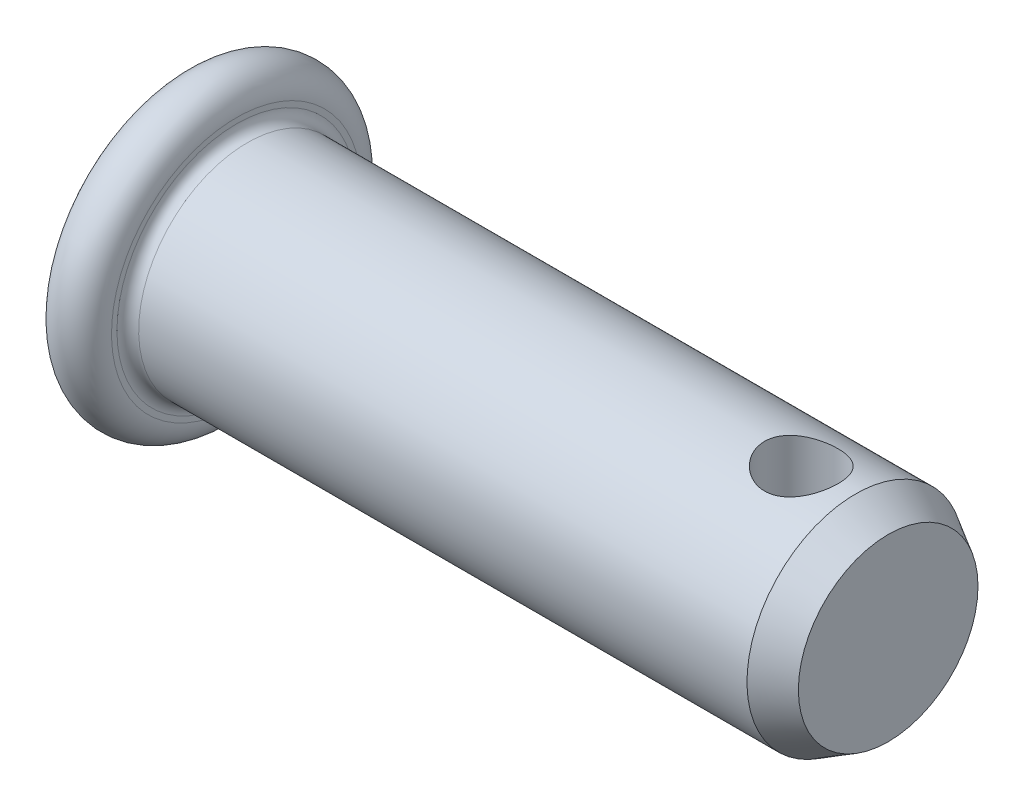
ISO-10303-21;
HEADER;
FILE_DESCRIPTION(('STEP AP214'),'2;1');
FILE_NAME('part.step','',(''),(''),'','','');
FILE_SCHEMA(('AUTOMOTIVE_DESIGN { 1 0 10303 214 1 1 1 1 }'));
ENDSEC;
DATA;
#1=APPLICATION_CONTEXT('core data for automotive mechanical design processes');
#2=APPLICATION_PROTOCOL_DEFINITION('international standard','automotive_design',2000,#1);
#3=PRODUCT_CONTEXT('',#1,'mechanical');
#4=PRODUCT('Part','Part','',(#3));
#5=PRODUCT_RELATED_PRODUCT_CATEGORY('part','',(#4));
#6=PRODUCT_DEFINITION_FORMATION('','',#4);
#7=PRODUCT_DEFINITION_CONTEXT('part definition',#1,'design');
#8=PRODUCT_DEFINITION('design','',#6,#7);
#9=PRODUCT_DEFINITION_SHAPE('','',#8);
#10=(LENGTH_UNIT() NAMED_UNIT(*) SI_UNIT(.MILLI.,.METRE.));
#11=(NAMED_UNIT(*) PLANE_ANGLE_UNIT() SI_UNIT($,.RADIAN.));
#12=(NAMED_UNIT(*) SI_UNIT($,.STERADIAN.) SOLID_ANGLE_UNIT());
#13=UNCERTAINTY_MEASURE_WITH_UNIT(LENGTH_MEASURE(1.E-05),#10,'distance_accuracy_value','');
#14=(GEOMETRIC_REPRESENTATION_CONTEXT(3) GLOBAL_UNCERTAINTY_ASSIGNED_CONTEXT((#13)) GLOBAL_UNIT_ASSIGNED_CONTEXT((#10,
#11,#12)) REPRESENTATION_CONTEXT('',''));
#15=CARTESIAN_POINT('',(0.,0.,0.));
#16=DIRECTION('',(0.,0.,1.));
#17=DIRECTION('',(1.,0.,0.));
#18=AXIS2_PLACEMENT_3D('',#15,#16,#17);
#19=CARTESIAN_POINT('',(32.5,0.,0.));
#20=DIRECTION('',(-1.,0.,0.));
#21=DIRECTION('',(0.,-1.,0.));
#22=AXIS2_PLACEMENT_3D('',#19,#20,#21);
#23=PLANE('',#22);
#24=CARTESIAN_POINT('',(32.5,0.,0.));
#25=DIRECTION('',(-1.,0.,0.));
#26=DIRECTION('',(0.,-1.,0.));
#27=AXIS2_PLACEMENT_3D('',#24,#25,#26);
#28=CIRCLE('',#27,4.13397459621556);
#29=CARTESIAN_POINT('',(32.5,-4.13397459621556,0.));
#30=VERTEX_POINT('',#29);
#31=EDGE_CURVE('E121',#30,#30,#28,.T.);
#32=ORIENTED_EDGE('',*,*,#31,.F.);
#33=EDGE_LOOP('',(#32));
#34=FACE_BOUND('',#33,.T.);
#35=ADVANCED_FACE('F41',(#34),#23,.F.);
#36=CARTESIAN_POINT('',(0.,0.,0.));
#37=DIRECTION('',(1.,0.,0.));
#38=DIRECTION('',(0.,1.,0.));
#39=AXIS2_PLACEMENT_3D('',#36,#37,#38);
#40=PLANE('',#39);
#41=CARTESIAN_POINT('',(0.,0.,0.));
#42=DIRECTION('',(-1.,0.,0.));
#43=DIRECTION('',(0.,-1.,0.));
#44=AXIS2_PLACEMENT_3D('',#41,#42,#43);
#45=CIRCLE('',#44,5.75);
#46=CARTESIAN_POINT('',(0.,-5.75,0.));
#47=VERTEX_POINT('',#46);
#48=EDGE_CURVE('E61',#47,#47,#45,.T.);
#49=ORIENTED_EDGE('',*,*,#48,.T.);
#50=EDGE_LOOP('',(#49));
#51=FACE_BOUND('',#50,.T.);
#52=ADVANCED_FACE('F92',(#51),#40,.F.);
#53=CARTESIAN_POINT('',(1.25,0.,0.));
#54=DIRECTION('',(-1.,0.,0.));
#55=DIRECTION('',(0.,-1.,0.));
#56=AXIS2_PLACEMENT_3D('',#53,#54,#55);
#57=TOROIDAL_SURFACE('',#56,5.75,1.25);
#58=ORIENTED_EDGE('',*,*,#48,.F.);
#59=EDGE_LOOP('',(#58));
#60=FACE_BOUND('',#59,.T.);
#61=CARTESIAN_POINT('',(2.5,0.,0.));
#62=DIRECTION('',(-1.,0.,0.));
#63=DIRECTION('',(0.,-1.,0.));
#64=AXIS2_PLACEMENT_3D('',#61,#62,#63);
#65=CIRCLE('',#64,5.75);
#66=CARTESIAN_POINT('',(2.5,-5.75,0.));
#67=VERTEX_POINT('',#66);
#68=EDGE_CURVE('E112',#67,#67,#65,.T.);
#69=ORIENTED_EDGE('',*,*,#68,.T.);
#70=EDGE_LOOP('',(#69));
#71=FACE_BOUND('',#70,.T.);
#72=ADVANCED_FACE('F97',(#60,#71),#57,.T.);
#73=CARTESIAN_POINT('',(2.5,5.,0.));
#74=DIRECTION('',(-1.,0.,0.));
#75=DIRECTION('',(0.,-1.,0.));
#76=AXIS2_PLACEMENT_3D('',#73,#74,#75);
#77=PLANE('',#76);
#78=CARTESIAN_POINT('',(2.5,0.,0.));
#79=DIRECTION('',(-1.,0.,0.));
#80=DIRECTION('',(0.,-1.,0.));
#81=AXIS2_PLACEMENT_3D('',#78,#79,#80);
#82=CIRCLE('',#81,5.5);
#83=CARTESIAN_POINT('',(2.5,-5.5,0.));
#84=VERTEX_POINT('',#83);
#85=EDGE_CURVE('E55',#84,#84,#82,.T.);
#86=ORIENTED_EDGE('',*,*,#85,.T.);
#87=EDGE_LOOP('',(#86));
#88=FACE_BOUND('',#87,.T.);
#89=ORIENTED_EDGE('',*,*,#68,.F.);
#90=EDGE_LOOP('',(#89));
#91=FACE_BOUND('',#90,.T.);
#92=ADVANCED_FACE('F87',(#88,#91),#77,.F.);
#93=CARTESIAN_POINT('',(-19.830028721469,0.,0.));
#94=DIRECTION('',(-1.,0.,0.));
#95=DIRECTION('',(0.,-1.,0.));
#96=AXIS2_PLACEMENT_3D('',#93,#94,#95);
#97=CYLINDRICAL_SURFACE('',#96,5.);
#98=CARTESIAN_POINT('',(30.19,-5.,0.));
#99=CARTESIAN_POINT('',(30.1900006918504,-5.00000045056717,-0.0921385131153169));
#100=CARTESIAN_POINT('',(30.1824405119812,-4.99742980033067,-0.184272351405152));
#101=CARTESIAN_POINT('',(30.152495224045,-4.98742855442286,-0.365821855868845));
#102=CARTESIAN_POINT('',(30.1301089883997,-4.97999758910651,-0.455237314758522));
#103=CARTESIAN_POINT('',(30.0713696916064,-4.96108211682783,-0.628706537182501));
#104=CARTESIAN_POINT('',(30.0350403717091,-4.94960450288728,-0.712769133037777));
#105=CARTESIAN_POINT('',(29.949554915602,-4.92376417409423,-0.873607547611714));
#106=CARTESIAN_POINT('',(29.9003961389006,-4.90940086546343,-0.950381861853274));
#107=CARTESIAN_POINT('',(29.7888159478463,-4.87872761336153,-1.09718908516297));
#108=CARTESIAN_POINT('',(29.726020551823,-4.86237009414981,-1.16692774930251));
#109=CARTESIAN_POINT('',(29.5897445946719,-4.82981068297855,-1.29511038759622));
#110=CARTESIAN_POINT('',(29.5162615975571,-4.81360882739877,-1.35355177971134));
#111=CARTESIAN_POINT('',(29.3580234426598,-4.78266857450005,-1.45918054224399));
#112=CARTESIAN_POINT('',(29.2729982244481,-4.76798796706557,-1.5059819132161));
#113=CARTESIAN_POINT('',(29.0957073752976,-4.7424775851353,-1.58449458498341));
#114=CARTESIAN_POINT('',(29.003444035897,-4.73164659783481,-1.61621063940347));
#115=CARTESIAN_POINT('',(28.8176471158009,-4.71556355120261,-1.66254228036207));
#116=CARTESIAN_POINT('',(28.7242673446411,-4.71013180305776,-1.67771041442634));
#117=CARTESIAN_POINT('',(28.5361423592289,-4.70493129849957,-1.69224311493125));
#118=CARTESIAN_POINT('',(28.4413975907791,-4.70516073326958,-1.69161272918972));
#119=CARTESIAN_POINT('',(28.257979152769,-4.71109947063846,-1.67499459106792));
#120=CARTESIAN_POINT('',(28.1692298883246,-4.71654983323877,-1.65973249174622));
#121=CARTESIAN_POINT('',(27.9956347725773,-4.73189189293263,-1.61546963423993));
#122=CARTESIAN_POINT('',(27.9107894024014,-4.74178413584829,-1.58646718760539));
#123=CARTESIAN_POINT('',(27.7457802305489,-4.76507670387297,-1.5150803423626));
#124=CARTESIAN_POINT('',(27.665716277077,-4.77853200768648,-1.47248386332134));
#125=CARTESIAN_POINT('',(27.5136452842373,-4.80741209390034,-1.37526536695573));
#126=CARTESIAN_POINT('',(27.4416406337687,-4.82283745737049,-1.32063979819046));
#127=CARTESIAN_POINT('',(27.3036607504199,-4.85493361131289,-1.1974462526055));
#128=CARTESIAN_POINT('',(27.2382180100354,-4.87162676708435,-1.12828646225945));
#129=CARTESIAN_POINT('',(27.1197183671268,-4.90365328955362,-0.979769469863469));
#130=CARTESIAN_POINT('',(27.0666627204889,-4.9189865182753,-0.900411235090659));
#131=CARTESIAN_POINT('',(26.973998382321,-4.94677682639062,-0.732596479150803));
#132=CARTESIAN_POINT('',(26.9345360277025,-4.95920217067292,-0.644053535548994));
#133=CARTESIAN_POINT('',(26.8712327603327,-4.9795458915031,-0.461064996672977));
#134=CARTESIAN_POINT('',(26.8473862613948,-4.98746587959759,-0.366621525424761));
#135=CARTESIAN_POINT('',(26.8169434906425,-4.99763779991018,-0.179017979212137));
#136=CARTESIAN_POINT('',(26.8096279601887,-5.00012589830827,-0.0859872719132688));
#137=CARTESIAN_POINT('',(26.8104010586122,-4.99986429340045,0.0999932499399075));
#138=CARTESIAN_POINT('',(26.8184870040828,-4.9971155025203,0.192943075763361));
#139=CARTESIAN_POINT('',(26.8492665278181,-4.9868449335468,0.373220245910748));
#140=CARTESIAN_POINT('',(26.8715154762021,-4.9794685322321,0.46063260688111));
#141=CARTESIAN_POINT('',(26.9294304072199,-4.96083062033554,0.630446107073972));
#142=CARTESIAN_POINT('',(26.9650981094489,-4.94956861183369,0.712846602459817));
#143=CARTESIAN_POINT('',(27.0498918993164,-4.92392538615764,0.872751427938536));
#144=CARTESIAN_POINT('',(27.09935194724,-4.9094689041066,0.950066248868446));
#145=CARTESIAN_POINT('',(27.2099358504471,-4.87907195541903,1.09553093716916));
#146=CARTESIAN_POINT('',(27.2710633560279,-4.86313102515738,1.16367792487296));
#147=CARTESIAN_POINT('',(27.4066278547169,-4.83061488465068,1.29219257149813));
#148=CARTESIAN_POINT('',(27.4815537449685,-4.81404489292989,1.35204709165641));
#149=CARTESIAN_POINT('',(27.6407395608002,-4.78290162302843,1.45840083890517));
#150=CARTESIAN_POINT('',(27.7249996274417,-4.76832837503072,1.5048998641244));
#151=CARTESIAN_POINT('',(27.9005558467309,-4.74296479117321,1.58302861289797));
#152=CARTESIAN_POINT('',(27.9918411713276,-4.73216877047788,1.6146807061863));
#153=CARTESIAN_POINT('',(28.1788975745702,-4.71575556278436,1.66201363128498));
#154=CARTESIAN_POINT('',(28.2746665345621,-4.71013595521709,1.67770192836753));
#155=CARTESIAN_POINT('',(28.4625321038996,-4.70499226252193,1.69206974596965));
#156=CARTESIAN_POINT('',(28.5545557184338,-4.70516208036229,1.69160337024957));
#157=CARTESIAN_POINT('',(28.7371397493141,-4.71081828526887,1.67578638358827));
#158=CARTESIAN_POINT('',(28.8277002571394,-4.71630433862495,1.66043670689989));
#159=CARTESIAN_POINT('',(29.0029727124063,-4.73174387519661,1.61590051246225));
#160=CARTESIAN_POINT('',(29.0877656012953,-4.74160540451003,1.58699813825242));
#161=CARTESIAN_POINT('',(29.2513623914585,-4.76464852544708,1.51640905723716));
#162=CARTESIAN_POINT('',(29.3301649351356,-4.77783086676635,1.47471946316784));
#163=CARTESIAN_POINT('',(29.4833584654807,-4.80676383911182,1.37756883958769));
#164=CARTESIAN_POINT('',(29.5573954528445,-4.8226028540317,1.32157609835243));
#165=CARTESIAN_POINT('',(29.6952981751836,-4.85470196582897,1.19829918039497));
#166=CARTESIAN_POINT('',(29.7591609864161,-4.87096218219153,1.13101176930181));
#167=CARTESIAN_POINT('',(29.8775130005392,-4.90286225421893,0.983784682070706));
#168=CARTESIAN_POINT('',(29.93151781827,-4.91845031404995,0.903442955866436));
#169=CARTESIAN_POINT('',(30.0252007714089,-4.94652737592363,0.734304028241292));
#170=CARTESIAN_POINT('',(30.0648820931723,-4.95901706702509,0.645508712937846));
#171=CARTESIAN_POINT('',(30.1274112572639,-4.97910830402289,0.465200551816097));
#172=CARTESIAN_POINT('',(30.1508050538972,-4.9868671747766,0.373895037638043));
#173=CARTESIAN_POINT('',(30.1820967790642,-4.9973120419477,0.188390810790899));
#174=CARTESIAN_POINT('',(30.1899992927232,-4.99999953938636,0.0941929625841441));
#175=CARTESIAN_POINT('',(30.19,-5.,0.));
#176=B_SPLINE_CURVE_WITH_KNOTS('',3,(#98,#99,#100,#101,#102,#103,#104,#105,#106,#107,#108,#109,
#110,#111,#112,#113,#114,#115,#116,#117,#118,#119,#120,#121,#122,#123,#124,#125,#126,#127,#128,
#129,#130,#131,#132,#133,#134,#135,#136,#137,#138,#139,#140,#141,#142,#143,#144,#145,#146,#147,
#148,#149,#150,#151,#152,#153,#154,#155,#156,#157,#158,#159,#160,#161,#162,#163,#164,#165,#166,
#167,#168,#169,#170,#171,#172,#173,#174,#175),.UNSPECIFIED.,.T.,.F.,(4,2,2,2,2,2,2,2,2,2,2,2,2,
2,2,2,2,2,2,2,2,2,2,2,2,2,2,2,2,2,2,2,2,2,2,2,2,2,4),(0.,0.276068824773617,0.552158648049831,
0.827780436845123,1.10345899746949,1.38795697907979,1.67251990722093,1.9655383046997,
2.25846430611443,2.54127784994968,2.82400103259505,3.09339103343423,3.36281414621345,
3.63666483506981,3.91059648363437,4.1992596234399,4.48795201714565,4.77966169105388,
5.07126695594427,5.34991803682659,5.62852057263642,5.89878121161704,6.16907649593834,
6.44658980000861,6.72419007002309,7.01477826618177,7.30537085441404,7.59552419187038,
7.88554178025712,8.16025065602602,8.43494228891764,8.70411601025341,8.97335055391011,
9.25460455637491,9.53593923729816,9.8286680317086,10.1213316664941,10.4036396792684,
10.6858641216143),.UNSPECIFIED.);
#177=CARTESIAN_POINT('',(30.19,-5.,0.));
#178=VERTEX_POINT('',#177);
#179=EDGE_CURVE('E45',#178,#178,#176,.T.);
#180=ORIENTED_EDGE('',*,*,#179,.T.);
#181=EDGE_LOOP('',(#180));
#182=FACE_BOUND('',#181,.T.);
#183=CARTESIAN_POINT('',(28.5,4.70573054902212,1.69));
#184=CARTESIAN_POINT('',(28.408031457333,4.70573000528724,1.69000070852625));
#185=CARTESIAN_POINT('',(28.3160676352778,4.70845614295335,1.68246736586167));
#186=CARTESIAN_POINT('',(28.134869748614,4.71900744775723,1.65263836623879));
#187=CARTESIAN_POINT('',(28.0456360721963,4.72683333651731,1.63034062008839));
#188=CARTESIAN_POINT('',(27.8725537881386,4.74659862882114,1.57185969208586));
#189=CARTESIAN_POINT('',(27.7886947752268,4.75852978056925,1.53570434825443));
#190=CARTESIAN_POINT('',(27.628204796293,4.78514912030707,1.45063003281527));
#191=CARTESIAN_POINT('',(27.5515754998777,4.79983794281378,1.40170812271493));
#192=CARTESIAN_POINT('',(27.4046364158929,4.83098043192526,1.29038050191949));
#193=CARTESIAN_POINT('',(27.3346598616982,4.84747897413991,1.22754740792189));
#194=CARTESIAN_POINT('',(27.2060091852618,4.88000316329026,1.09109255205413));
#195=CARTESIAN_POINT('',(27.1473369362658,4.89602873147709,1.01746900564205));
#196=CARTESIAN_POINT('',(27.0414385412422,4.9263223701437,0.85907645177216));
#197=CARTESIAN_POINT('',(26.9945629404002,4.9405315337328,0.774060813082532));
#198=CARTESIAN_POINT('',(26.9159106702385,4.96506149834048,0.596788082066136));
#199=CARTESIAN_POINT('',(26.8841298094177,4.97538337861325,0.504533008283437));
#200=CARTESIAN_POINT('',(26.8377032882565,4.99065784685647,0.318895105621448));
#201=CARTESIAN_POINT('',(26.8224864718865,4.99578894278889,0.225670081395816));
#202=CARTESIAN_POINT('',(26.8078024286421,5.00073809893505,0.0378581123198386));
#203=CARTESIAN_POINT('',(26.8083310304546,5.00055756631804,-0.056728465187736));
#204=CARTESIAN_POINT('',(26.8247636935164,4.99502398684516,-0.240530442796588));
#205=CARTESIAN_POINT('',(26.8400470762719,4.98987974909304,-0.329808656609213));
#206=CARTESIAN_POINT('',(26.8845271718276,4.97526018255719,-0.504449183690134));
#207=CARTESIAN_POINT('',(26.9137248341748,4.9657845581901,-0.589811229272951));
#208=CARTESIAN_POINT('',(26.9855588574035,4.94330427659483,-0.755536260667337));
#209=CARTESIAN_POINT('',(27.0283691724393,4.93025425993232,-0.835817438593924));
#210=CARTESIAN_POINT('',(27.1260688967338,4.90197960145489,-0.988237741697666));
#211=CARTESIAN_POINT('',(27.180961730445,4.88675434355877,-1.0603745497937));
#212=CARTESIAN_POINT('',(27.3043817854772,4.85486204601166,-1.19814745922028));
#213=CARTESIAN_POINT('',(27.3734396876571,4.8381608878543,-1.26330096757399));
#214=CARTESIAN_POINT('',(27.5216397307293,4.80581602303003,-1.38126125433041));
#215=CARTESIAN_POINT('',(27.6007835150626,4.79017248933464,-1.43406601658603));
#216=CARTESIAN_POINT('',(27.7684772701205,4.76152418153718,-1.52652370830052));
#217=CARTESIAN_POINT('',(27.85715068464,4.74856257864028,-1.56596714724568));
#218=CARTESIAN_POINT('',(28.0404298010655,4.72724497541913,-1.6291965766666));
#219=CARTESIAN_POINT('',(28.1350329129242,4.7188869796739,-1.65298935175003));
#220=CARTESIAN_POINT('',(28.3228003247017,4.70817645900976,-1.68324735084615));
#221=CARTESIAN_POINT('',(28.4158289024272,4.70556412713611,-1.6904628838659));
#222=CARTESIAN_POINT('',(28.601784692007,4.70591345274982,-1.68949122272273));
#223=CARTESIAN_POINT('',(28.6947119196484,4.70887406087362,-1.68130692828925));
#224=CARTESIAN_POINT('',(28.8743696322845,4.71977612743211,-1.65044286868273));
#225=CARTESIAN_POINT('',(28.9612029211109,4.72753617455771,-1.62829050474267));
#226=CARTESIAN_POINT('',(29.1299003739918,4.74696151170112,-1.57075522808946));
#227=CARTESIAN_POINT('',(29.2117636384885,4.75862750620782,-1.53536992850785));
#228=CARTESIAN_POINT('',(29.3711367765386,4.78501786010993,-1.45107186939905));
#229=CARTESIAN_POINT('',(29.4484197645754,4.79982903992135,-1.40175808389253));
#230=CARTESIAN_POINT('',(29.5938846017369,4.83067495097899,-1.29145428764301));
#231=CARTESIAN_POINT('',(29.6620636849067,4.84671005176271,-1.23046074198519));
#232=CARTESIAN_POINT('',(29.79088843422,4.87916082844229,-1.09493086460888));
#233=CARTESIAN_POINT('',(29.8509913950697,4.89555582044436,-1.01987217556628));
#234=CARTESIAN_POINT('',(29.957787176883,4.92609562252592,-0.860330721449053));
#235=CARTESIAN_POINT('',(30.0044804332735,4.94024050566211,-0.775848262497655));
#236=CARTESIAN_POINT('',(30.0827123723036,4.96462493653938,-0.600248030552293));
#237=CARTESIAN_POINT('',(30.1143462045983,4.97488891771341,-0.509176222637726));
#238=CARTESIAN_POINT('',(30.1617134829704,4.99045939950963,-0.322588725796816));
#239=CARTESIAN_POINT('',(30.1774528488992,4.99576774578906,-0.227074705235694));
#240=CARTESIAN_POINT('',(30.1920398648111,5.00068566157363,-0.0392712628295689));
#241=CARTESIAN_POINT('',(30.1916656206947,5.00055774538541,0.0529514913033055));
#242=CARTESIAN_POINT('',(30.1759642211632,4.995267920959,0.235958959364557));
#243=CARTESIAN_POINT('',(30.1606383369512,4.99010644067936,0.326743794879339));
#244=CARTESIAN_POINT('',(30.1159889659031,4.97542847606851,0.502783611495429));
#245=CARTESIAN_POINT('',(30.0869037664643,4.96598623879562,0.588105665739278));
#246=CARTESIAN_POINT('',(30.0157835477129,4.94371953745451,0.752689408815463));
#247=CARTESIAN_POINT('',(29.9737461647608,4.93089445611382,0.831949988193377));
#248=CARTESIAN_POINT('',(29.8760978355215,4.90257940411559,0.985410864263535));
#249=CARTESIAN_POINT('',(29.8200360444139,4.88700737996888,1.05930893455233));
#250=CARTESIAN_POINT('',(29.6966909016656,4.85514405204458,1.19690149043362));
#251=CARTESIAN_POINT('',(29.6294039189462,4.83885251678038,1.26059266122734));
#252=CARTESIAN_POINT('',(29.4822562117124,4.80659724574638,1.37859382499613));
#253=CARTESIAN_POINT('',(29.4019961189298,4.79067362365059,1.43241839089534));
#254=CARTESIAN_POINT('',(29.233071520515,4.76176303840917,1.52578272074006));
#255=CARTESIAN_POINT('',(29.1444089204399,4.74877541167691,1.56532571378233));
#256=CARTESIAN_POINT('',(28.9643991527001,4.72777691403826,1.62762854332163));
#257=CARTESIAN_POINT('',(28.8732621061069,4.71960435057483,1.65093912359502));
#258=CARTESIAN_POINT('',(28.68808099871,4.70858243533796,1.6821216204916));
#259=CARTESIAN_POINT('',(28.5940380316302,4.7057311049922,1.68999927553039));
#260=CARTESIAN_POINT('',(28.5,4.70573054902212,1.69));
#261=B_SPLINE_CURVE_WITH_KNOTS('',3,(#183,#184,#185,#186,#187,#188,#189,#190,#191,#192,#193,
#194,#195,#196,#197,#198,#199,#200,#201,#202,#203,#204,#205,#206,#207,#208,#209,#210,#211,#212,
#213,#214,#215,#216,#217,#218,#219,#220,#221,#222,#223,#224,#225,#226,#227,#228,#229,#230,#231,
#232,#233,#234,#235,#236,#237,#238,#239,#240,#241,#242,#243,#244,#245,#246,#247,#248,#249,#250,
#251,#252,#253,#254,#255,#256,#257,#258,#259,#260),.UNSPECIFIED.,.T.,.F.,(4,2,2,2,2,2,2,2,2,2,2,
2,2,2,2,2,2,2,2,2,2,2,2,2,2,2,2,2,2,2,2,2,2,2,2,2,2,2,4),(0.,0.275557180238395,
0.551153360694022,0.826198783477872,1.1013075696506,1.38646895230613,1.67167754872578,
1.96456195130985,2.25736497825656,2.53971624176164,2.82199270477312,3.09288996641886,
3.36380571745118,3.6383328696715,3.91293792936167,4.20081296933331,4.48873497713802,
4.78098230041688,5.0731028500039,5.35171660910324,5.63027791153223,5.89890414203835,
6.16757884893632,6.44495580279194,6.72241683868574,7.01366547758175,7.30490465826475,
7.59427844888417,7.88354442321698,8.15885852953679,8.43414923042234,8.70483777273376,
8.97557574218758,9.25649110907307,9.53749752212662,9.82990440027492,10.1222451230988,
10.4041077541313,10.6858655604392),.UNSPECIFIED.);
#262=CARTESIAN_POINT('',(28.5,4.70573054902212,1.69));
#263=VERTEX_POINT('',#262);
#264=EDGE_CURVE('E64',#263,#263,#261,.T.);
#265=ORIENTED_EDGE('',*,*,#264,.T.);
#266=EDGE_LOOP('',(#265));
#267=FACE_BOUND('',#266,.T.);
#268=CARTESIAN_POINT('',(3.,0.,0.));
#269=DIRECTION('',(-1.,0.,0.));
#270=DIRECTION('',(0.,-1.,0.));
#271=AXIS2_PLACEMENT_3D('',#268,#269,#270);
#272=CIRCLE('',#271,5.);
#273=CARTESIAN_POINT('',(3.,-5.,0.));
#274=VERTEX_POINT('',#273);
#275=EDGE_CURVE('E10',#274,#274,#272,.F.);
#276=ORIENTED_EDGE('',*,*,#275,.T.);
#277=EDGE_LOOP('',(#276));
#278=FACE_BOUND('',#277,.T.);
#279=CARTESIAN_POINT('',(31.,0.,0.));
#280=DIRECTION('',(-1.,0.,0.));
#281=DIRECTION('',(0.,-1.,0.));
#282=AXIS2_PLACEMENT_3D('',#279,#280,#281);
#283=CIRCLE('',#282,5.);
#284=CARTESIAN_POINT('',(31.,-5.00000000000001,0.));
#285=VERTEX_POINT('',#284);
#286=EDGE_CURVE('E115',#285,#285,#283,.T.);
#287=ORIENTED_EDGE('',*,*,#286,.T.);
#288=EDGE_LOOP('',(#287));
#289=FACE_BOUND('',#288,.T.);
#290=ADVANCED_FACE('F70',(#182,#267,#278,#289),#97,.T.);
#291=CARTESIAN_POINT('',(32.5,0.,0.));
#292=DIRECTION('',(-1.,0.,0.));
#293=DIRECTION('',(0.,-1.,0.));
#294=AXIS2_PLACEMENT_3D('',#291,#292,#293);
#295=CONICAL_SURFACE('',#294,4.13397459621556,0.5235987755983);
#296=ORIENTED_EDGE('',*,*,#286,.F.);
#297=EDGE_LOOP('',(#296));
#298=FACE_BOUND('',#297,.T.);
#299=ORIENTED_EDGE('',*,*,#31,.T.);
#300=EDGE_LOOP('',(#299));
#301=FACE_BOUND('',#300,.T.);
#302=ADVANCED_FACE('F78',(#298,#301),#295,.T.);
#303=CARTESIAN_POINT('',(3.,0.,0.));
#304=DIRECTION('',(-1.,0.,0.));
#305=DIRECTION('',(0.,-1.,0.));
#306=AXIS2_PLACEMENT_3D('',#303,#304,#305);
#307=TOROIDAL_SURFACE('',#306,5.5,0.5);
#308=ORIENTED_EDGE('',*,*,#275,.F.);
#309=EDGE_LOOP('',(#308));
#310=FACE_BOUND('',#309,.T.);
#311=ORIENTED_EDGE('',*,*,#85,.F.);
#312=EDGE_LOOP('',(#311));
#313=FACE_BOUND('',#312,.T.);
#314=ADVANCED_FACE('F43',(#310,#313),#307,.F.);
#315=CARTESIAN_POINT('',(28.5,-7.,0.));
#316=DIRECTION('',(0.,1.,0.));
#317=DIRECTION('',(0.,0.,1.));
#318=AXIS2_PLACEMENT_3D('',#315,#316,#317);
#319=CYLINDRICAL_SURFACE('',#318,1.69);
#320=ORIENTED_EDGE('',*,*,#264,.F.);
#321=EDGE_LOOP('',(#320));
#322=FACE_BOUND('',#321,.T.);
#323=ORIENTED_EDGE('',*,*,#179,.F.);
#324=EDGE_LOOP('',(#323));
#325=FACE_BOUND('',#324,.T.);
#326=ADVANCED_FACE('F74',(#322,#325),#319,.F.);
#327=CLOSED_SHELL('',(#35,#52,#72,#92,#290,#302,#314,#326));
#328=MANIFOLD_SOLID_BREP('B2',#327);
#329=ADVANCED_BREP_SHAPE_REPRESENTATION('',(#18,#328),#14);
#330=SHAPE_DEFINITION_REPRESENTATION(#9,#329);
ENDSEC;
END-ISO-10303-21;
